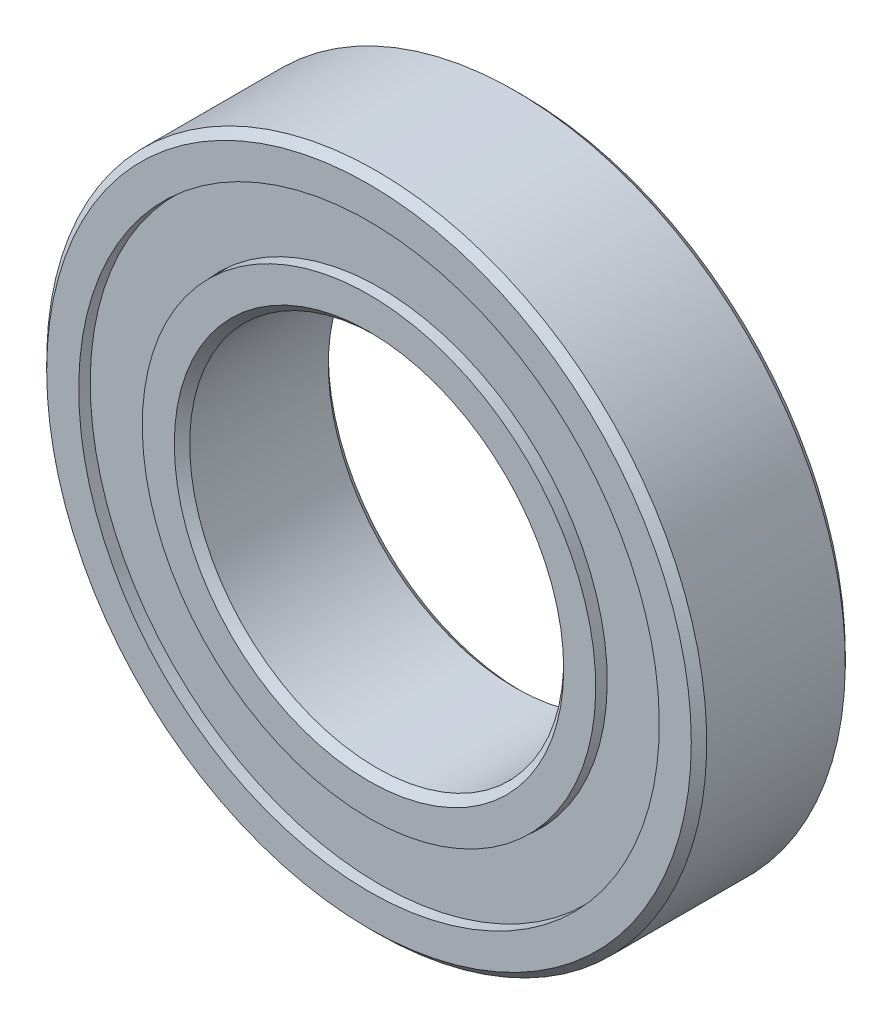
ISO-10303-21;
HEADER;
FILE_DESCRIPTION(('STEP AP214'),'2;1');
FILE_NAME('part.step','',(''),(''),'','','');
FILE_SCHEMA(('AUTOMOTIVE_DESIGN { 1 0 10303 214 1 1 1 1 }'));
ENDSEC;
DATA;
#1=APPLICATION_CONTEXT('core data for automotive mechanical design processes');
#2=APPLICATION_PROTOCOL_DEFINITION('international standard','automotive_design',2000,#1);
#3=PRODUCT_CONTEXT('',#1,'mechanical');
#4=PRODUCT('Part','Part','',(#3));
#5=PRODUCT_RELATED_PRODUCT_CATEGORY('part','',(#4));
#6=PRODUCT_DEFINITION_FORMATION('','',#4);
#7=PRODUCT_DEFINITION_CONTEXT('part definition',#1,'design');
#8=PRODUCT_DEFINITION('design','',#6,#7);
#9=PRODUCT_DEFINITION_SHAPE('','',#8);
#10=(LENGTH_UNIT() NAMED_UNIT(*) SI_UNIT(.MILLI.,.METRE.));
#11=(NAMED_UNIT(*) PLANE_ANGLE_UNIT() SI_UNIT($,.RADIAN.));
#12=(NAMED_UNIT(*) SI_UNIT($,.STERADIAN.) SOLID_ANGLE_UNIT());
#13=UNCERTAINTY_MEASURE_WITH_UNIT(LENGTH_MEASURE(1.E-05),#10,'distance_accuracy_value','');
#14=(GEOMETRIC_REPRESENTATION_CONTEXT(3) GLOBAL_UNCERTAINTY_ASSIGNED_CONTEXT((#13)) GLOBAL_UNIT_ASSIGNED_CONTEXT((#10,
#11,#12)) REPRESENTATION_CONTEXT('',''));
#15=CARTESIAN_POINT('',(0.,0.,0.));
#16=DIRECTION('',(0.,0.,1.));
#17=DIRECTION('',(1.,0.,0.));
#18=AXIS2_PLACEMENT_3D('',#15,#16,#17);
#19=CARTESIAN_POINT('',(6.35252960510315,9.88472901076646,0.));
#20=DIRECTION('',(0.540640817455587,0.841253532831188,0.));
#21=DIRECTION('',(0.,0.,-1.));
#22=AXIS2_PLACEMENT_3D('',#19,#20,#21);
#23=SPHERICAL_SURFACE('',#22,2.12277479717143);
#24=CARTESIAN_POINT('',(5.20487090348627,8.09893721324099,0.));
#25=VERTEX_POINT('',#24);
#26=VERTEX_LOOP('',#25);
#27=FACE_BOUND('',#26,.T.);
#28=CARTESIAN_POINT('',(7.50018830672003,11.6705208082919,0.));
#29=VERTEX_POINT('',#28);
#30=VERTEX_LOOP('',#29);
#31=FACE_BOUND('',#30,.T.);
#32=ADVANCED_FACE('P0_F16',(#27,#31),#23,.T.);
#33=CLOSED_SHELL('',(#32));
#34=MANIFOLD_SOLID_BREP('P0_B1',#33);
#35=CARTESIAN_POINT('',(8.8800574986626,-7.69461362385702,0.));
#36=DIRECTION('',(0.755749574354264,-0.654860733945279,0.));
#37=DIRECTION('',(0.,0.,-1.));
#38=AXIS2_PLACEMENT_3D('',#35,#36,#37);
#39=SPHERICAL_SURFACE('',#38,2.12277479717143);
#40=CARTESIAN_POINT('',(10.4843436480749,-9.08473548553324,0.));
#41=VERTEX_POINT('',#40);
#42=VERTEX_LOOP('',#41);
#43=FACE_BOUND('',#42,.T.);
#44=CARTESIAN_POINT('',(7.27577134925033,-6.3044917621808,0.));
#45=VERTEX_POINT('',#44);
#46=VERTEX_LOOP('',#45);
#47=FACE_BOUND('',#46,.T.);
#48=ADVANCED_FACE('P1_F16',(#43,#47),#39,.T.);
#49=CLOSED_SHELL('',(#48));
#50=MANIFOLD_SOLID_BREP('P1_B1',#49);
#51=CARTESIAN_POINT('',(0.,0.,0.));
#52=DIRECTION('',(0.,0.,1.));
#53=DIRECTION('',(0.,-1.,0.));
#54=AXIS2_PLACEMENT_3D('',#51,#52,#53);
#55=TOROIDAL_SURFACE('',#54,11.75,2.12277479717143);
#56=CARTESIAN_POINT('',(0.,0.,1.55555555555555));
#57=DIRECTION('',(0.,0.,1.));
#58=DIRECTION('',(0.,-1.,0.));
#59=AXIS2_PLACEMENT_3D('',#56,#57,#58);
#60=CIRCLE('',#59,10.3055555555556);
#61=CARTESIAN_POINT('',(0.,-10.3055555555556,1.55555555555555));
#62=VERTEX_POINT('',#61);
#63=EDGE_CURVE('P2_E31',#62,#62,#60,.T.);
#64=ORIENTED_EDGE('',*,*,#63,.F.);
#65=EDGE_LOOP('',(#64));
#66=FACE_BOUND('',#65,.T.);
#67=CARTESIAN_POINT('',(0.,0.,-1.55555555555555));
#68=DIRECTION('',(0.,0.,1.));
#69=DIRECTION('',(0.,-1.,0.));
#70=AXIS2_PLACEMENT_3D('',#67,#68,#69);
#71=CIRCLE('',#70,10.3055555555556);
#72=CARTESIAN_POINT('',(0.,-10.3055555555556,-1.55555555555555));
#73=VERTEX_POINT('',#72);
#74=EDGE_CURVE('P2_E33',#73,#73,#71,.F.);
#75=ORIENTED_EDGE('',*,*,#74,.F.);
#76=EDGE_LOOP('',(#75));
#77=FACE_BOUND('',#76,.T.);
#78=ADVANCED_FACE('P2_F15',(#66,#77),#55,.F.);
#79=CARTESIAN_POINT('',(0.,0.,3.50000000000002));
#80=DIRECTION('',(0.,0.,1.));
#81=DIRECTION('',(0.,-1.,0.));
#82=AXIS2_PLACEMENT_3D('',#79,#80,#81);
#83=CYLINDRICAL_SURFACE('',#82,10.3055555555556);
#84=CARTESIAN_POINT('',(0.,0.,3.50000000000003));
#85=DIRECTION('',(0.,0.,1.));
#86=DIRECTION('',(0.,-1.,0.));
#87=AXIS2_PLACEMENT_3D('',#84,#85,#86);
#88=CIRCLE('',#87,10.3055555555556);
#89=CARTESIAN_POINT('',(0.,-10.3055555555556,3.50000000000002));
#90=VERTEX_POINT('',#89);
#91=EDGE_CURVE('P2_E19',#90,#90,#88,.F.);
#92=ORIENTED_EDGE('',*,*,#91,.T.);
#93=EDGE_LOOP('',(#92));
#94=FACE_BOUND('',#93,.T.);
#95=ORIENTED_EDGE('',*,*,#63,.T.);
#96=EDGE_LOOP('',(#95));
#97=FACE_BOUND('',#96,.T.);
#98=ADVANCED_FACE('P2_F47',(#94,#97),#83,.T.);
#99=CARTESIAN_POINT('',(0.,0.,3.50000000000002));
#100=DIRECTION('',(0.,0.,1.));
#101=DIRECTION('',(0.,-1.,0.));
#102=AXIS2_PLACEMENT_3D('',#99,#100,#101);
#103=CYLINDRICAL_SURFACE('',#102,10.3055555555556);
#104=ORIENTED_EDGE('',*,*,#74,.T.);
#105=EDGE_LOOP('',(#104));
#106=FACE_BOUND('',#105,.T.);
#107=CARTESIAN_POINT('',(0.,0.,-3.50000000000003));
#108=DIRECTION('',(0.,0.,1.));
#109=DIRECTION('',(0.,-1.,0.));
#110=AXIS2_PLACEMENT_3D('',#107,#108,#109);
#111=CIRCLE('',#110,10.3055555555556);
#112=CARTESIAN_POINT('',(0.,-10.3055555555556,-3.50000000000003));
#113=VERTEX_POINT('',#112);
#114=EDGE_CURVE('P2_E45',#113,#113,#111,.T.);
#115=ORIENTED_EDGE('',*,*,#114,.T.);
#116=EDGE_LOOP('',(#115));
#117=FACE_BOUND('',#116,.T.);
#118=ADVANCED_FACE('P2_F57',(#106,#117),#103,.T.);
#119=CARTESIAN_POINT('',(0.,10.3055555555556,3.50000000000003));
#120=DIRECTION('',(0.,0.,-1.));
#121=DIRECTION('',(0.,1.,0.));
#122=AXIS2_PLACEMENT_3D('',#119,#120,#121);
#123=PLANE('',#122);
#124=ORIENTED_EDGE('',*,*,#91,.F.);
#125=EDGE_LOOP('',(#124));
#126=FACE_BOUND('',#125,.T.);
#127=CARTESIAN_POINT('',(0.,0.,3.50000000000003));
#128=DIRECTION('',(0.,0.,1.));
#129=DIRECTION('',(0.,-1.,0.));
#130=AXIS2_PLACEMENT_3D('',#127,#128,#129);
#131=CIRCLE('',#130,8.85);
#132=CARTESIAN_POINT('',(0.,-8.85,3.50000000000003));
#133=VERTEX_POINT('',#132);
#134=EDGE_CURVE('P2_E37',#133,#133,#131,.F.);
#135=ORIENTED_EDGE('',*,*,#134,.T.);
#136=EDGE_LOOP('',(#135));
#137=FACE_BOUND('',#136,.T.);
#138=ADVANCED_FACE('P2_F55',(#126,#137),#123,.F.);
#139=CARTESIAN_POINT('',(0.,8.84999999999999,-3.50000000000003));
#140=DIRECTION('',(0.,0.,1.));
#141=DIRECTION('',(0.,-1.,0.));
#142=AXIS2_PLACEMENT_3D('',#139,#140,#141);
#143=PLANE('',#142);
#144=CARTESIAN_POINT('',(0.,0.,-3.50000000000003));
#145=DIRECTION('',(0.,0.,-1.));
#146=DIRECTION('',(0.,1.,0.));
#147=AXIS2_PLACEMENT_3D('',#144,#145,#146);
#148=CIRCLE('',#147,8.84999999999999);
#149=CARTESIAN_POINT('',(0.,8.84999999999999,-3.50000000000003));
#150=VERTEX_POINT('',#149);
#151=EDGE_CURVE('P2_E29',#150,#150,#148,.F.);
#152=ORIENTED_EDGE('',*,*,#151,.T.);
#153=EDGE_LOOP('',(#152));
#154=FACE_BOUND('',#153,.T.);
#155=ORIENTED_EDGE('',*,*,#114,.F.);
#156=EDGE_LOOP('',(#155));
#157=FACE_BOUND('',#156,.T.);
#158=ADVANCED_FACE('P2_F54',(#154,#157),#143,.F.);
#159=CARTESIAN_POINT('',(0.,0.,3.50000000000003));
#160=DIRECTION('',(0.,0.,1.));
#161=DIRECTION('',(0.,-1.,0.));
#162=AXIS2_PLACEMENT_3D('',#159,#160,#161);
#163=CONICAL_SURFACE('',#162,8.85,0.785398163397441);
#164=ORIENTED_EDGE('',*,*,#134,.F.);
#165=EDGE_LOOP('',(#164));
#166=FACE_BOUND('',#165,.T.);
#167=CARTESIAN_POINT('',(0.,0.,3.15000000000002));
#168=DIRECTION('',(0.,0.,1.));
#169=DIRECTION('',(0.,-1.,0.));
#170=AXIS2_PLACEMENT_3D('',#167,#168,#169);
#171=CIRCLE('',#170,8.5);
#172=CARTESIAN_POINT('',(0.,-8.5,3.15000000000002));
#173=VERTEX_POINT('',#172);
#174=EDGE_CURVE('P2_E23',#173,#173,#171,.F.);
#175=ORIENTED_EDGE('',*,*,#174,.T.);
#176=EDGE_LOOP('',(#175));
#177=FACE_BOUND('',#176,.T.);
#178=ADVANCED_FACE('P2_F58',(#166,#177),#163,.F.);
#179=CARTESIAN_POINT('',(0.,0.,-3.50000000000003));
#180=DIRECTION('',(0.,0.,-1.));
#181=DIRECTION('',(0.,1.,0.));
#182=AXIS2_PLACEMENT_3D('',#179,#180,#181);
#183=CONICAL_SURFACE('',#182,8.84999999999999,0.785398163397437);
#184=CARTESIAN_POINT('',(0.,0.,-3.15000000000003));
#185=DIRECTION('',(0.,0.,1.));
#186=DIRECTION('',(0.,-1.,0.));
#187=AXIS2_PLACEMENT_3D('',#184,#185,#186);
#188=CIRCLE('',#187,8.5);
#189=CARTESIAN_POINT('',(0.,-8.5,-3.15000000000003));
#190=VERTEX_POINT('',#189);
#191=EDGE_CURVE('P2_E10',#190,#190,#188,.T.);
#192=ORIENTED_EDGE('',*,*,#191,.T.);
#193=EDGE_LOOP('',(#192));
#194=FACE_BOUND('',#193,.T.);
#195=ORIENTED_EDGE('',*,*,#151,.F.);
#196=EDGE_LOOP('',(#195));
#197=FACE_BOUND('',#196,.T.);
#198=ADVANCED_FACE('P2_F61',(#194,#197),#183,.F.);
#199=CARTESIAN_POINT('',(0.,0.,3.50000000000002));
#200=DIRECTION('',(0.,0.,1.));
#201=DIRECTION('',(0.,-1.,0.));
#202=AXIS2_PLACEMENT_3D('',#199,#200,#201);
#203=CYLINDRICAL_SURFACE('',#202,8.5);
#204=ORIENTED_EDGE('',*,*,#174,.F.);
#205=EDGE_LOOP('',(#204));
#206=FACE_BOUND('',#205,.T.);
#207=ORIENTED_EDGE('',*,*,#191,.F.);
#208=EDGE_LOOP('',(#207));
#209=FACE_BOUND('',#208,.T.);
#210=ADVANCED_FACE('P2_F70',(#206,#209),#203,.F.);
#211=CLOSED_SHELL('',(#78,#98,#118,#138,#158,#178,#198,#210));
#212=MANIFOLD_SOLID_BREP('P2_B1',#211);
#213=CARTESIAN_POINT('',(0.,10.3309555555556,-3.00188739858573));
#214=DIRECTION('',(0.,0.,1.));
#215=DIRECTION('',(0.,-1.,0.));
#216=AXIS2_PLACEMENT_3D('',#213,#214,#215);
#217=PLANE('',#216);
#218=CARTESIAN_POINT('',(0.,0.,-3.00188739858573));
#219=DIRECTION('',(0.,0.,1.));
#220=DIRECTION('',(0.,-1.,0.));
#221=AXIS2_PLACEMENT_3D('',#218,#219,#220);
#222=CIRCLE('',#221,10.3309555555556);
#223=CARTESIAN_POINT('',(0.,-10.3309555555556,-3.00188739858573));
#224=VERTEX_POINT('',#223);
#225=EDGE_CURVE('P3_E18',#224,#224,#222,.T.);
#226=ORIENTED_EDGE('',*,*,#225,.T.);
#227=EDGE_LOOP('',(#226));
#228=FACE_BOUND('',#227,.T.);
#229=CARTESIAN_POINT('',(0.,0.,-3.00188739858573));
#230=DIRECTION('',(0.,0.,1.));
#231=DIRECTION('',(0.,-1.,0.));
#232=AXIS2_PLACEMENT_3D('',#229,#230,#231);
#233=CIRCLE('',#232,13.1690444444444);
#234=CARTESIAN_POINT('',(0.,-13.1690444444444,-3.00188739858573));
#235=VERTEX_POINT('',#234);
#236=EDGE_CURVE('P3_E30',#235,#235,#233,.T.);
#237=ORIENTED_EDGE('',*,*,#236,.F.);
#238=EDGE_LOOP('',(#237));
#239=FACE_BOUND('',#238,.T.);
#240=ADVANCED_FACE('P3_F15',(#228,#239),#217,.F.);
#241=CARTESIAN_POINT('',(0.,0.,3.50000000000002));
#242=DIRECTION('',(0.,0.,1.));
#243=DIRECTION('',(0.,-1.,0.));
#244=AXIS2_PLACEMENT_3D('',#241,#242,#243);
#245=CYLINDRICAL_SURFACE('',#244,10.3309555555556);
#246=ORIENTED_EDGE('',*,*,#225,.F.);
#247=EDGE_LOOP('',(#246));
#248=FACE_BOUND('',#247,.T.);
#249=CARTESIAN_POINT('',(0.,0.,-2.62088739858573));
#250=DIRECTION('',(0.,0.,1.));
#251=DIRECTION('',(0.,-1.,0.));
#252=AXIS2_PLACEMENT_3D('',#249,#250,#251);
#253=CIRCLE('',#252,10.3309555555556);
#254=CARTESIAN_POINT('',(0.,-10.3309555555556,-2.62088739858573));
#255=VERTEX_POINT('',#254);
#256=EDGE_CURVE('P3_E22',#255,#255,#253,.T.);
#257=ORIENTED_EDGE('',*,*,#256,.T.);
#258=EDGE_LOOP('',(#257));
#259=FACE_BOUND('',#258,.T.);
#260=ADVANCED_FACE('P3_F40',(#248,#259),#245,.F.);
#261=CARTESIAN_POINT('',(0.,0.,3.50000000000002));
#262=DIRECTION('',(0.,0.,1.));
#263=DIRECTION('',(0.,-1.,0.));
#264=AXIS2_PLACEMENT_3D('',#261,#262,#263);
#265=CYLINDRICAL_SURFACE('',#264,13.1690444444444);
#266=CARTESIAN_POINT('',(0.,0.,-2.62088739858573));
#267=DIRECTION('',(0.,0.,1.));
#268=DIRECTION('',(0.,-1.,0.));
#269=AXIS2_PLACEMENT_3D('',#266,#267,#268);
#270=CIRCLE('',#269,13.1690444444444);
#271=CARTESIAN_POINT('',(0.,-13.1690444444444,-2.62088739858573));
#272=VERTEX_POINT('',#271);
#273=EDGE_CURVE('P3_E10',#272,#272,#270,.F.);
#274=ORIENTED_EDGE('',*,*,#273,.T.);
#275=EDGE_LOOP('',(#274));
#276=FACE_BOUND('',#275,.T.);
#277=ORIENTED_EDGE('',*,*,#236,.T.);
#278=EDGE_LOOP('',(#277));
#279=FACE_BOUND('',#278,.T.);
#280=ADVANCED_FACE('P3_F37',(#276,#279),#265,.T.);
#281=CARTESIAN_POINT('',(0.,10.3309555555556,-2.62088739858573));
#282=DIRECTION('',(0.,0.,-1.));
#283=DIRECTION('',(0.,1.,0.));
#284=AXIS2_PLACEMENT_3D('',#281,#282,#283);
#285=PLANE('',#284);
#286=ORIENTED_EDGE('',*,*,#273,.F.);
#287=EDGE_LOOP('',(#286));
#288=FACE_BOUND('',#287,.T.);
#289=ORIENTED_EDGE('',*,*,#256,.F.);
#290=EDGE_LOOP('',(#289));
#291=FACE_BOUND('',#290,.T.);
#292=ADVANCED_FACE('P3_F43',(#288,#291),#285,.F.);
#293=CLOSED_SHELL('',(#240,#260,#280,#292));
#294=MANIFOLD_SOLID_BREP('P3_B1',#293);
#295=CARTESIAN_POINT('',(-8.8800574986625,-7.69461362385714,0.));
#296=DIRECTION('',(-0.755749574354255,-0.654860733945289,0.));
#297=DIRECTION('',(0.,0.,-1.));
#298=AXIS2_PLACEMENT_3D('',#295,#296,#297);
#299=SPHERICAL_SURFACE('',#298,2.12277479717143);
#300=CARTESIAN_POINT('',(-10.4843436480747,-9.08473548553338,0.));
#301=VERTEX_POINT('',#300);
#302=VERTEX_LOOP('',#301);
#303=FACE_BOUND('',#302,.T.);
#304=CARTESIAN_POINT('',(-7.27577134925025,-6.3044917621809,0.));
#305=VERTEX_POINT('',#304);
#306=VERTEX_LOOP('',#305);
#307=FACE_BOUND('',#306,.T.);
#308=ADVANCED_FACE('P4_F16',(#303,#307),#299,.T.);
#309=CLOSED_SHELL('',(#308));
#310=MANIFOLD_SOLID_BREP('P4_B1',#309);
#311=CARTESIAN_POINT('',(11.630401942101,-1.67219934971099,0.));
#312=DIRECTION('',(0.989821441880934,-0.142314838273276,0.));
#313=DIRECTION('',(0.,0.,-1.));
#314=AXIS2_PLACEMENT_3D('',#311,#312,#313);
#315=SPHERICAL_SURFACE('',#314,2.12277479717143);
#316=CARTESIAN_POINT('',(9.52923393157625,-1.37009699776095,0.));
#317=VERTEX_POINT('',#316);
#318=VERTEX_LOOP('',#317);
#319=FACE_BOUND('',#318,.T.);
#320=CARTESIAN_POINT('',(13.7315699526257,-1.97430170166102,0.));
#321=VERTEX_POINT('',#320);
#322=VERTEX_LOOP('',#321);
#323=FACE_BOUND('',#322,.T.);
#324=ADVANCED_FACE('P5_F16',(#319,#323),#315,.T.);
#325=CLOSED_SHELL('',(#324));
#326=MANIFOLD_SOLID_BREP('P5_B1',#325);
#327=CARTESIAN_POINT('',(-6.35252960510328,9.88472901076637,0.));
#328=DIRECTION('',(-0.540640817455599,0.84125353283118,0.));
#329=DIRECTION('',(0.,0.,-1.));
#330=AXIS2_PLACEMENT_3D('',#327,#328,#329);
#331=SPHERICAL_SURFACE('',#330,2.12277479717143);
#332=CARTESIAN_POINT('',(-7.50018830672019,11.6705208082918,0.));
#333=VERTEX_POINT('',#332);
#334=VERTEX_LOOP('',#333);
#335=FACE_BOUND('',#334,.T.);
#336=CARTESIAN_POINT('',(-5.20487090348638,8.09893721324091,0.));
#337=VERTEX_POINT('',#336);
#338=VERTEX_LOOP('',#337);
#339=FACE_BOUND('',#338,.T.);
#340=ADVANCED_FACE('P6_F16',(#335,#339),#331,.T.);
#341=CLOSED_SHELL('',(#340));
#342=MANIFOLD_SOLID_BREP('P6_B1',#341);
#343=CARTESIAN_POINT('',(3.31035754288688,-11.2740424399703,0.));
#344=DIRECTION('',(0.281732556841437,-0.959492973614495,0.));
#345=DIRECTION('',(0.,0.,-1.));
#346=AXIS2_PLACEMENT_3D('',#343,#344,#345);
#347=SPHERICAL_SURFACE('',#346,2.12277479717143);
#348=CARTESIAN_POINT('',(3.90841231409255,-13.3108299424222,0.));
#349=VERTEX_POINT('',#348);
#350=VERTEX_LOOP('',#349);
#351=FACE_BOUND('',#350,.T.);
#352=CARTESIAN_POINT('',(2.71230277168121,-9.2372549375184,0.));
#353=VERTEX_POINT('',#352);
#354=VERTEX_LOOP('',#353);
#355=FACE_BOUND('',#354,.T.);
#356=ADVANCED_FACE('P7_F16',(#351,#355),#347,.T.);
#357=CLOSED_SHELL('',(#356));
#358=MANIFOLD_SOLID_BREP('P7_B1',#357);
#359=CARTESIAN_POINT('',(0.,0.,0.));
#360=DIRECTION('',(0.,0.,1.));
#361=DIRECTION('',(0.,-1.,0.));
#362=AXIS2_PLACEMENT_3D('',#359,#360,#361);
#363=TOROIDAL_SURFACE('',#362,11.75,2.12277479717143);
#364=CARTESIAN_POINT('',(0.,0.,-1.55555555555556));
#365=DIRECTION('',(0.,0.,1.));
#366=DIRECTION('',(0.,-1.,0.));
#367=AXIS2_PLACEMENT_3D('',#364,#365,#366);
#368=CIRCLE('',#367,13.1944444444444);
#369=CARTESIAN_POINT('',(0.,-13.1944444444444,-1.55555555555556));
#370=VERTEX_POINT('',#369);
#371=EDGE_CURVE('P8_E31',#370,#370,#368,.F.);
#372=ORIENTED_EDGE('',*,*,#371,.T.);
#373=EDGE_LOOP('',(#372));
#374=FACE_BOUND('',#373,.T.);
#375=CARTESIAN_POINT('',(0.,0.,1.55555555555555));
#376=DIRECTION('',(0.,0.,1.));
#377=DIRECTION('',(0.,-1.,0.));
#378=AXIS2_PLACEMENT_3D('',#375,#376,#377);
#379=CIRCLE('',#378,13.1944444444444);
#380=CARTESIAN_POINT('',(0.,-13.1944444444444,1.55555555555555));
#381=VERTEX_POINT('',#380);
#382=EDGE_CURVE('P8_E33',#381,#381,#379,.T.);
#383=ORIENTED_EDGE('',*,*,#382,.T.);
#384=EDGE_LOOP('',(#383));
#385=FACE_BOUND('',#384,.T.);
#386=ADVANCED_FACE('P8_F15',(#374,#385),#363,.F.);
#387=CARTESIAN_POINT('',(0.,0.,3.50000000000002));
#388=DIRECTION('',(0.,0.,1.));
#389=DIRECTION('',(0.,-1.,0.));
#390=AXIS2_PLACEMENT_3D('',#387,#388,#389);
#391=CYLINDRICAL_SURFACE('',#390,13.1944444444444);
#392=CARTESIAN_POINT('',(0.,0.,-3.50000000000003));
#393=DIRECTION('',(0.,0.,1.));
#394=DIRECTION('',(0.,-1.,0.));
#395=AXIS2_PLACEMENT_3D('',#392,#393,#394);
#396=CIRCLE('',#395,13.1944444444444);
#397=CARTESIAN_POINT('',(0.,-13.1944444444444,-3.50000000000003));
#398=VERTEX_POINT('',#397);
#399=EDGE_CURVE('P8_E19',#398,#398,#396,.F.);
#400=ORIENTED_EDGE('',*,*,#399,.T.);
#401=EDGE_LOOP('',(#400));
#402=FACE_BOUND('',#401,.T.);
#403=ORIENTED_EDGE('',*,*,#371,.F.);
#404=EDGE_LOOP('',(#403));
#405=FACE_BOUND('',#404,.T.);
#406=ADVANCED_FACE('P8_F47',(#402,#405),#391,.F.);
#407=CARTESIAN_POINT('',(0.,0.,3.50000000000002));
#408=DIRECTION('',(0.,0.,1.));
#409=DIRECTION('',(0.,-1.,0.));
#410=AXIS2_PLACEMENT_3D('',#407,#408,#409);
#411=CYLINDRICAL_SURFACE('',#410,13.1944444444444);
#412=ORIENTED_EDGE('',*,*,#382,.F.);
#413=EDGE_LOOP('',(#412));
#414=FACE_BOUND('',#413,.T.);
#415=CARTESIAN_POINT('',(0.,0.,3.50000000000001));
#416=DIRECTION('',(0.,0.,1.));
#417=DIRECTION('',(0.,-1.,0.));
#418=AXIS2_PLACEMENT_3D('',#415,#416,#417);
#419=CIRCLE('',#418,13.1944444444444);
#420=CARTESIAN_POINT('',(0.,-13.1944444444444,3.50000000000001));
#421=VERTEX_POINT('',#420);
#422=EDGE_CURVE('P8_E45',#421,#421,#419,.T.);
#423=ORIENTED_EDGE('',*,*,#422,.T.);
#424=EDGE_LOOP('',(#423));
#425=FACE_BOUND('',#424,.T.);
#426=ADVANCED_FACE('P8_F57',(#414,#425),#411,.F.);
#427=CARTESIAN_POINT('',(0.,14.65,-3.50000000000003));
#428=DIRECTION('',(0.,0.,1.));
#429=DIRECTION('',(0.,-1.,0.));
#430=AXIS2_PLACEMENT_3D('',#427,#428,#429);
#431=PLANE('',#430);
#432=ORIENTED_EDGE('',*,*,#399,.F.);
#433=EDGE_LOOP('',(#432));
#434=FACE_BOUND('',#433,.T.);
#435=CARTESIAN_POINT('',(0.,0.,-3.50000000000003));
#436=DIRECTION('',(0.,0.,1.));
#437=DIRECTION('',(0.,-1.,0.));
#438=AXIS2_PLACEMENT_3D('',#435,#436,#437);
#439=CIRCLE('',#438,14.65);
#440=CARTESIAN_POINT('',(0.,-14.65,-3.50000000000003));
#441=VERTEX_POINT('',#440);
#442=EDGE_CURVE('P8_E37',#441,#441,#439,.T.);
#443=ORIENTED_EDGE('',*,*,#442,.F.);
#444=EDGE_LOOP('',(#443));
#445=FACE_BOUND('',#444,.T.);
#446=ADVANCED_FACE('P8_F55',(#434,#445),#431,.F.);
#447=CARTESIAN_POINT('',(0.,14.65,3.50000000000002));
#448=DIRECTION('',(0.,0.,-1.));
#449=DIRECTION('',(0.,1.,0.));
#450=AXIS2_PLACEMENT_3D('',#447,#448,#449);
#451=PLANE('',#450);
#452=CARTESIAN_POINT('',(0.,0.,3.50000000000001));
#453=DIRECTION('',(0.,0.,-1.));
#454=DIRECTION('',(0.,1.,0.));
#455=AXIS2_PLACEMENT_3D('',#452,#453,#454);
#456=CIRCLE('',#455,14.65);
#457=CARTESIAN_POINT('',(0.,14.65,3.50000000000002));
#458=VERTEX_POINT('',#457);
#459=EDGE_CURVE('P8_E29',#458,#458,#456,.T.);
#460=ORIENTED_EDGE('',*,*,#459,.F.);
#461=EDGE_LOOP('',(#460));
#462=FACE_BOUND('',#461,.T.);
#463=ORIENTED_EDGE('',*,*,#422,.F.);
#464=EDGE_LOOP('',(#463));
#465=FACE_BOUND('',#464,.T.);
#466=ADVANCED_FACE('P8_F54',(#462,#465),#451,.F.);
#467=CARTESIAN_POINT('',(0.,0.,-3.15000000000003));
#468=DIRECTION('',(0.,0.,1.));
#469=DIRECTION('',(0.,-1.,0.));
#470=AXIS2_PLACEMENT_3D('',#467,#468,#469);
#471=CONICAL_SURFACE('',#470,15.,0.785398163397452);
#472=CARTESIAN_POINT('',(0.,0.,-3.15000000000003));
#473=DIRECTION('',(0.,0.,1.));
#474=DIRECTION('',(0.,-1.,0.));
#475=AXIS2_PLACEMENT_3D('',#472,#473,#474);
#476=CIRCLE('',#475,15.);
#477=CARTESIAN_POINT('',(0.,-15.,-3.15000000000003));
#478=VERTEX_POINT('',#477);
#479=EDGE_CURVE('P8_E23',#478,#478,#476,.T.);
#480=ORIENTED_EDGE('',*,*,#479,.F.);
#481=EDGE_LOOP('',(#480));
#482=FACE_BOUND('',#481,.T.);
#483=ORIENTED_EDGE('',*,*,#442,.T.);
#484=EDGE_LOOP('',(#483));
#485=FACE_BOUND('',#484,.T.);
#486=ADVANCED_FACE('P8_F58',(#482,#485),#471,.T.);
#487=CARTESIAN_POINT('',(0.,0.,3.15000000000002));
#488=DIRECTION('',(0.,0.,-1.));
#489=DIRECTION('',(0.,1.,0.));
#490=AXIS2_PLACEMENT_3D('',#487,#488,#489);
#491=CONICAL_SURFACE('',#490,15.,0.785398163397452);
#492=CARTESIAN_POINT('',(0.,0.,3.15000000000002));
#493=DIRECTION('',(0.,0.,1.));
#494=DIRECTION('',(0.,-1.,0.));
#495=AXIS2_PLACEMENT_3D('',#492,#493,#494);
#496=CIRCLE('',#495,15.);
#497=CARTESIAN_POINT('',(0.,-15.,3.15000000000001));
#498=VERTEX_POINT('',#497);
#499=EDGE_CURVE('P8_E10',#498,#498,#496,.F.);
#500=ORIENTED_EDGE('',*,*,#499,.F.);
#501=EDGE_LOOP('',(#500));
#502=FACE_BOUND('',#501,.T.);
#503=ORIENTED_EDGE('',*,*,#459,.T.);
#504=EDGE_LOOP('',(#503));
#505=FACE_BOUND('',#504,.T.);
#506=ADVANCED_FACE('P8_F65',(#502,#505),#491,.T.);
#507=CARTESIAN_POINT('',(0.,0.,3.50000000000002));
#508=DIRECTION('',(0.,0.,1.));
#509=DIRECTION('',(0.,-1.,0.));
#510=AXIS2_PLACEMENT_3D('',#507,#508,#509);
#511=CYLINDRICAL_SURFACE('',#510,15.);
#512=ORIENTED_EDGE('',*,*,#499,.T.);
#513=EDGE_LOOP('',(#512));
#514=FACE_BOUND('',#513,.T.);
#515=ORIENTED_EDGE('',*,*,#479,.T.);
#516=EDGE_LOOP('',(#515));
#517=FACE_BOUND('',#516,.T.);
#518=ADVANCED_FACE('P8_F69',(#514,#517),#511,.T.);
#519=CLOSED_SHELL('',(#386,#406,#426,#446,#466,#486,#506,#518));
#520=MANIFOLD_SOLID_BREP('P8_B1',#519);
#521=CARTESIAN_POINT('',(10.6881759454155,4.88112640277228,0.));
#522=DIRECTION('',(0.909631995354514,0.415415013001896,0.));
#523=DIRECTION('',(0.,0.,-1.));
#524=AXIS2_PLACEMENT_3D('',#521,#522,#523);
#525=SPHERICAL_SURFACE('',#524,2.12277479717143);
#526=CARTESIAN_POINT('',(12.6191198198549,5.76295892273935,0.));
#527=VERTEX_POINT('',#526);
#528=VERTEX_LOOP('',#527);
#529=FACE_BOUND('',#528,.T.);
#530=CARTESIAN_POINT('',(8.75723207097622,3.99929388280522,0.));
#531=VERTEX_POINT('',#530);
#532=VERTEX_LOOP('',#531);
#533=FACE_BOUND('',#532,.T.);
#534=ADVANCED_FACE('P9_F16',(#529,#533),#525,.T.);
#535=CLOSED_SHELL('',(#534));
#536=MANIFOLD_SOLID_BREP('P9_B1',#535);
#537=CARTESIAN_POINT('',(0.,10.3309555555556,3.00188739858572));
#538=DIRECTION('',(0.,0.,-1.));
#539=DIRECTION('',(0.,1.,0.));
#540=AXIS2_PLACEMENT_3D('',#537,#538,#539);
#541=PLANE('',#540);
#542=CARTESIAN_POINT('',(0.,0.,3.00188739858572));
#543=DIRECTION('',(0.,0.,1.));
#544=DIRECTION('',(0.,-1.,0.));
#545=AXIS2_PLACEMENT_3D('',#542,#543,#544);
#546=CIRCLE('',#545,13.1690444444444);
#547=CARTESIAN_POINT('',(0.,-13.1690444444444,3.00188739858571));
#548=VERTEX_POINT('',#547);
#549=EDGE_CURVE('P10_E18',#548,#548,#546,.F.);
#550=ORIENTED_EDGE('',*,*,#549,.F.);
#551=EDGE_LOOP('',(#550));
#552=FACE_BOUND('',#551,.T.);
#553=CARTESIAN_POINT('',(0.,0.,3.00188739858572));
#554=DIRECTION('',(0.,0.,1.));
#555=DIRECTION('',(0.,-1.,0.));
#556=AXIS2_PLACEMENT_3D('',#553,#554,#555);
#557=CIRCLE('',#556,10.3309555555556);
#558=CARTESIAN_POINT('',(0.,-10.3309555555556,3.00188739858571));
#559=VERTEX_POINT('',#558);
#560=EDGE_CURVE('P10_E30',#559,#559,#557,.F.);
#561=ORIENTED_EDGE('',*,*,#560,.T.);
#562=EDGE_LOOP('',(#561));
#563=FACE_BOUND('',#562,.T.);
#564=ADVANCED_FACE('P10_F15',(#552,#563),#541,.F.);
#565=CARTESIAN_POINT('',(0.,0.,3.50000000000002));
#566=DIRECTION('',(0.,0.,1.));
#567=DIRECTION('',(0.,-1.,0.));
#568=AXIS2_PLACEMENT_3D('',#565,#566,#567);
#569=CYLINDRICAL_SURFACE('',#568,13.1690444444444);
#570=ORIENTED_EDGE('',*,*,#549,.T.);
#571=EDGE_LOOP('',(#570));
#572=FACE_BOUND('',#571,.T.);
#573=CARTESIAN_POINT('',(0.,0.,2.62088739858571));
#574=DIRECTION('',(0.,0.,1.));
#575=DIRECTION('',(0.,-1.,0.));
#576=AXIS2_PLACEMENT_3D('',#573,#574,#575);
#577=CIRCLE('',#576,13.1690444444444);
#578=CARTESIAN_POINT('',(0.,-13.1690444444444,2.62088739858571));
#579=VERTEX_POINT('',#578);
#580=EDGE_CURVE('P10_E22',#579,#579,#577,.T.);
#581=ORIENTED_EDGE('',*,*,#580,.T.);
#582=EDGE_LOOP('',(#581));
#583=FACE_BOUND('',#582,.T.);
#584=ADVANCED_FACE('P10_F34',(#572,#583),#569,.T.);
#585=CARTESIAN_POINT('',(0.,0.,3.50000000000002));
#586=DIRECTION('',(0.,0.,1.));
#587=DIRECTION('',(0.,-1.,0.));
#588=AXIS2_PLACEMENT_3D('',#585,#586,#587);
#589=CYLINDRICAL_SURFACE('',#588,10.3309555555556);
#590=CARTESIAN_POINT('',(0.,0.,2.62088739858572));
#591=DIRECTION('',(0.,0.,1.));
#592=DIRECTION('',(0.,-1.,0.));
#593=AXIS2_PLACEMENT_3D('',#590,#591,#592);
#594=CIRCLE('',#593,10.3309555555556);
#595=CARTESIAN_POINT('',(0.,-10.3309555555556,2.62088739858571));
#596=VERTEX_POINT('',#595);
#597=EDGE_CURVE('P10_E10',#596,#596,#594,.F.);
#598=ORIENTED_EDGE('',*,*,#597,.T.);
#599=EDGE_LOOP('',(#598));
#600=FACE_BOUND('',#599,.T.);
#601=ORIENTED_EDGE('',*,*,#560,.F.);
#602=EDGE_LOOP('',(#601));
#603=FACE_BOUND('',#602,.T.);
#604=ADVANCED_FACE('P10_F43',(#600,#603),#589,.F.);
#605=CARTESIAN_POINT('',(0.,10.3309555555556,2.62088739858572));
#606=DIRECTION('',(0.,0.,1.));
#607=DIRECTION('',(0.,-1.,0.));
#608=AXIS2_PLACEMENT_3D('',#605,#606,#607);
#609=PLANE('',#608);
#610=ORIENTED_EDGE('',*,*,#597,.F.);
#611=EDGE_LOOP('',(#610));
#612=FACE_BOUND('',#611,.T.);
#613=ORIENTED_EDGE('',*,*,#580,.F.);
#614=EDGE_LOOP('',(#613));
#615=FACE_BOUND('',#614,.T.);
#616=ADVANCED_FACE('P10_F42',(#612,#615),#609,.F.);
#617=CLOSED_SHELL('',(#564,#584,#604,#616));
#618=MANIFOLD_SOLID_BREP('P10_B1',#617);
#619=CARTESIAN_POINT('',(-11.6304019421009,-1.67219934971114,0.));
#620=DIRECTION('',(-0.989821441880932,-0.142314838273289,0.));
#621=DIRECTION('',(0.,0.,-1.));
#622=AXIS2_PLACEMENT_3D('',#619,#620,#621);
#623=SPHERICAL_SURFACE('',#622,2.12277479717143);
#624=CARTESIAN_POINT('',(-13.7315699526257,-1.97430170166121,0.));
#625=VERTEX_POINT('',#624);
#626=VERTEX_LOOP('',#625);
#627=FACE_BOUND('',#626,.T.);
#628=CARTESIAN_POINT('',(-9.52923393157623,-1.37009699776108,0.));
#629=VERTEX_POINT('',#628);
#630=VERTEX_LOOP('',#629);
#631=FACE_BOUND('',#630,.T.);
#632=ADVANCED_FACE('P11_F16',(#627,#631),#623,.T.);
#633=CLOSED_SHELL('',(#632));
#634=MANIFOLD_SOLID_BREP('P11_B1',#633);
#635=CARTESIAN_POINT('',(-10.6881759454156,4.88112640277214,0.));
#636=DIRECTION('',(-0.909631995354519,0.415415013001884,0.));
#637=DIRECTION('',(0.,0.,-1.));
#638=AXIS2_PLACEMENT_3D('',#635,#636,#637);
#639=SPHERICAL_SURFACE('',#638,2.12277479717143);
#640=CARTESIAN_POINT('',(-12.6191198198549,5.76295892273918,0.));
#641=VERTEX_POINT('',#640);
#642=VERTEX_LOOP('',#641);
#643=FACE_BOUND('',#642,.T.);
#644=CARTESIAN_POINT('',(-8.75723207097627,3.9992938828051,0.));
#645=VERTEX_POINT('',#644);
#646=VERTEX_LOOP('',#645);
#647=FACE_BOUND('',#646,.T.);
#648=ADVANCED_FACE('P12_F16',(#643,#647),#639,.T.);
#649=CLOSED_SHELL('',(#648));
#650=MANIFOLD_SOLID_BREP('P12_B1',#649);
#651=CARTESIAN_POINT('',(0.,11.75,0.));
#652=DIRECTION('',(0.,1.,0.));
#653=DIRECTION('',(0.,0.,-1.));
#654=AXIS2_PLACEMENT_3D('',#651,#652,#653);
#655=SPHERICAL_SURFACE('',#654,2.12277479717143);
#656=CARTESIAN_POINT('',(0.,9.62722520282857,0.));
#657=VERTEX_POINT('',#656);
#658=VERTEX_LOOP('',#657);
#659=FACE_BOUND('',#658,.T.);
#660=CARTESIAN_POINT('',(0.,13.8727747971714,0.));
#661=VERTEX_POINT('',#660);
#662=VERTEX_LOOP('',#661);
#663=FACE_BOUND('',#662,.T.);
#664=ADVANCED_FACE('P13_F16',(#659,#663),#655,.T.);
#665=CLOSED_SHELL('',(#664));
#666=MANIFOLD_SOLID_BREP('P13_B1',#665);
#667=CARTESIAN_POINT('',(-3.31035754288673,-11.2740424399704,0.));
#668=DIRECTION('',(-0.281732556841424,-0.959492973614499,0.));
#669=DIRECTION('',(0.,0.,-1.));
#670=AXIS2_PLACEMENT_3D('',#667,#668,#669);
#671=SPHERICAL_SURFACE('',#670,2.12277479717143);
#672=CARTESIAN_POINT('',(-2.71230277168109,-9.23725493751843,0.));
#673=VERTEX_POINT('',#672);
#674=VERTEX_LOOP('',#673);
#675=FACE_BOUND('',#674,.T.);
#676=CARTESIAN_POINT('',(-3.90841231409237,-13.3108299424223,0.));
#677=VERTEX_POINT('',#676);
#678=VERTEX_LOOP('',#677);
#679=FACE_BOUND('',#678,.T.);
#680=ADVANCED_FACE('P14_F16',(#675,#679),#671,.T.);
#681=CLOSED_SHELL('',(#680));
#682=MANIFOLD_SOLID_BREP('P14_B1',#681);
#683=ADVANCED_BREP_SHAPE_REPRESENTATION('',(#18,#34,#50,#212,#294,#310,#326,#342,#358,#520,#536,
#618,#634,#650,#666,#682),#14);
#684=SHAPE_DEFINITION_REPRESENTATION(#9,#683);
ENDSEC;
END-ISO-10303-21;
